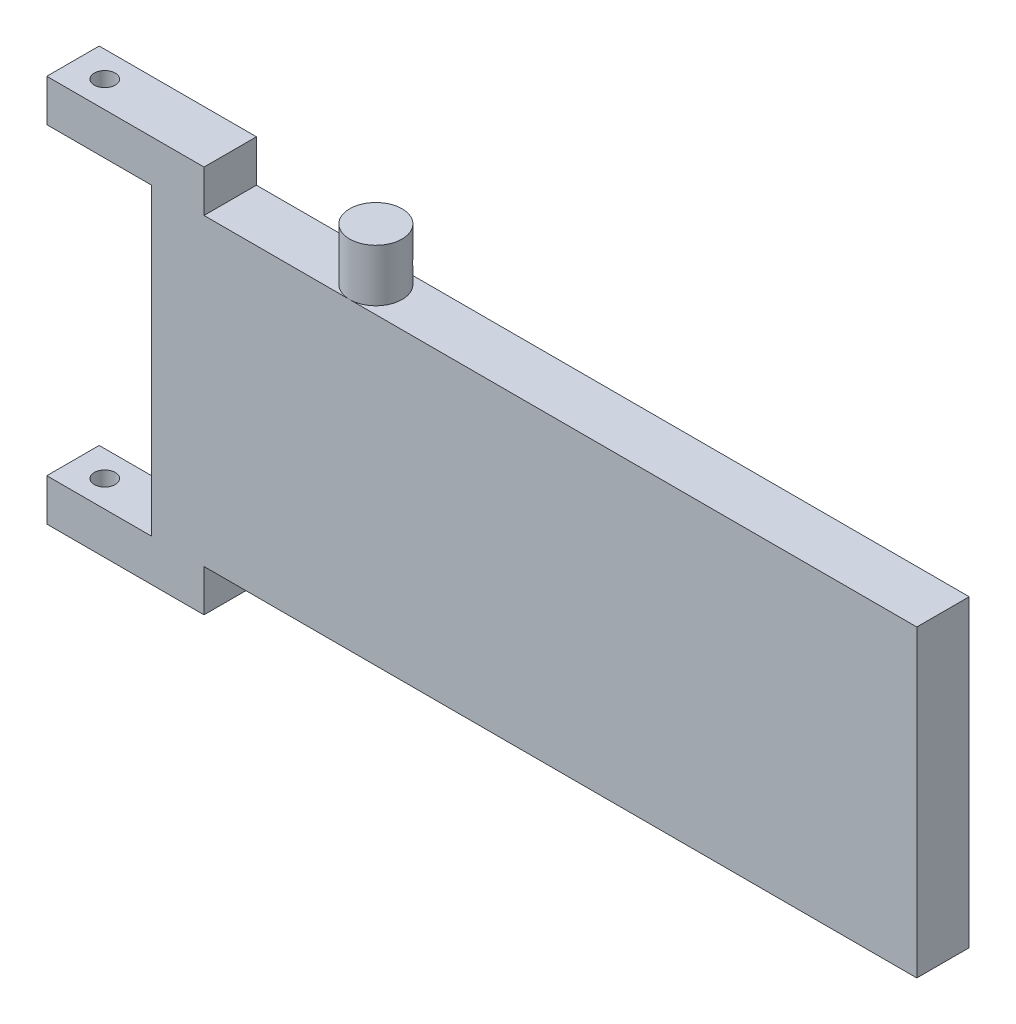
ISO-10303-21;
HEADER;
FILE_DESCRIPTION(('STEP AP214'),'2;1');
FILE_NAME('part.step','',(''),(''),'','','');
FILE_SCHEMA(('AUTOMOTIVE_DESIGN { 1 0 10303 214 1 1 1 1 }'));
ENDSEC;
DATA;
#1=APPLICATION_CONTEXT('core data for automotive mechanical design processes');
#2=APPLICATION_PROTOCOL_DEFINITION('international standard','automotive_design',2000,#1);
#3=PRODUCT_CONTEXT('',#1,'mechanical');
#4=PRODUCT('Part','Part','',(#3));
#5=PRODUCT_RELATED_PRODUCT_CATEGORY('part','',(#4));
#6=PRODUCT_DEFINITION_FORMATION('','',#4);
#7=PRODUCT_DEFINITION_CONTEXT('part definition',#1,'design');
#8=PRODUCT_DEFINITION('design','',#6,#7);
#9=PRODUCT_DEFINITION_SHAPE('','',#8);
#10=(LENGTH_UNIT() NAMED_UNIT(*) SI_UNIT(.MILLI.,.METRE.));
#11=(NAMED_UNIT(*) PLANE_ANGLE_UNIT() SI_UNIT($,.RADIAN.));
#12=(NAMED_UNIT(*) SI_UNIT($,.STERADIAN.) SOLID_ANGLE_UNIT());
#13=UNCERTAINTY_MEASURE_WITH_UNIT(LENGTH_MEASURE(1.E-05),#10,'distance_accuracy_value','');
#14=(GEOMETRIC_REPRESENTATION_CONTEXT(3) GLOBAL_UNCERTAINTY_ASSIGNED_CONTEXT((#13)) GLOBAL_UNIT_ASSIGNED_CONTEXT((#10,
#11,#12)) REPRESENTATION_CONTEXT('',''));
#15=CARTESIAN_POINT('',(0.,0.,0.));
#16=DIRECTION('',(0.,0.,1.));
#17=DIRECTION('',(1.,0.,0.));
#18=AXIS2_PLACEMENT_3D('',#15,#16,#17);
#19=CARTESIAN_POINT('',(18.8949988975342,34.,2.5));
#20=DIRECTION('',(0.,-1.,0.));
#21=DIRECTION('',(0.,0.,-1.));
#22=AXIS2_PLACEMENT_3D('',#19,#20,#21);
#23=CYLINDRICAL_SURFACE('',#22,2.5);
#24=CARTESIAN_POINT('',(18.8949988975342,34.,2.5));
#25=DIRECTION('',(0.,1.,0.));
#26=DIRECTION('',(0.,0.,1.));
#27=AXIS2_PLACEMENT_3D('',#24,#25,#26);
#28=CIRCLE('',#27,2.5);
#29=CARTESIAN_POINT('',(18.8949988975342,34.,5.));
#30=VERTEX_POINT('',#29);
#31=EDGE_CURVE('E223',#30,#30,#28,.T.);
#32=ORIENTED_EDGE('',*,*,#31,.F.);
#33=EDGE_LOOP('',(#32));
#34=FACE_BOUND('',#33,.T.);
#35=CARTESIAN_POINT('',(18.8949988975342,28.,2.5));
#36=DIRECTION('',(0.,-0.447213595499958,-0.894427190999916));
#37=DIRECTION('',(0.,-0.894427190999916,0.447213595499958));
#38=AXIS2_PLACEMENT_3D('',#35,#36,#37);
#39=ELLIPSE('',#38,5.59016994374948,2.5);
#40=CARTESIAN_POINT('',(16.8949988975342,31.,1.));
#41=VERTEX_POINT('',#40);
#42=CARTESIAN_POINT('',(20.8949988975342,31.,1.));
#43=VERTEX_POINT('',#42);
#44=EDGE_CURVE('E216',#41,#43,#39,.T.);
#45=ORIENTED_EDGE('',*,*,#44,.F.);
#46=CARTESIAN_POINT('',(18.8949988975342,34.,2.5));
#47=DIRECTION('',(0.,0.447213595499958,-0.894427190999916));
#48=DIRECTION('',(0.,-0.894427190999916,-0.447213595499958));
#49=AXIS2_PLACEMENT_3D('',#46,#47,#48);
#50=ELLIPSE('',#49,5.59016994374947,2.5);
#51=CARTESIAN_POINT('',(18.8949988975342,29.,0.));
#52=VERTEX_POINT('',#51);
#53=EDGE_CURVE('E204',#52,#41,#50,.T.);
#54=ORIENTED_EDGE('',*,*,#53,.F.);
#55=CARTESIAN_POINT('',(18.8949988975342,29.,2.5));
#56=DIRECTION('',(0.,1.,0.));
#57=DIRECTION('',(0.,0.,1.));
#58=AXIS2_PLACEMENT_3D('',#55,#56,#57);
#59=CIRCLE('',#58,2.5);
#60=CARTESIAN_POINT('',(18.8949988975342,29.,5.));
#61=VERTEX_POINT('',#60);
#62=EDGE_CURVE('E214',#52,#61,#59,.T.);
#63=ORIENTED_EDGE('',*,*,#62,.T.);
#64=EDGE_CURVE('E218',#61,#52,#59,.T.);
#65=ORIENTED_EDGE('',*,*,#64,.T.);
#66=EDGE_CURVE('E201',#43,#52,#50,.T.);
#67=ORIENTED_EDGE('',*,*,#66,.F.);
#68=EDGE_LOOP('',(#45,#54,#63,#65,#67));
#69=FACE_BOUND('',#68,.T.);
#70=ADVANCED_FACE('F39',(#34,#69),#23,.T.);
#71=CARTESIAN_POINT('',(0.,29.,5.));
#72=DIRECTION('',(0.,1.,0.));
#73=DIRECTION('',(0.,0.,1.));
#74=AXIS2_PLACEMENT_3D('',#71,#72,#73);
#75=PLANE('',#74);
#76=DIRECTION('',(1.,0.,0.));
#77=VECTOR('',#76,1.);
#78=CARTESIAN_POINT('',(0.,29.,5.));
#79=LINE('',#78,#77);
#80=CARTESIAN_POINT('',(5.,29.,5.));
#81=VERTEX_POINT('',#80);
#82=EDGE_CURVE('E232',#81,#61,#79,.T.);
#83=ORIENTED_EDGE('',*,*,#82,.T.);
#84=ORIENTED_EDGE('',*,*,#62,.F.);
#85=DIRECTION('',(1.,0.,0.));
#86=VECTOR('',#85,1.);
#87=CARTESIAN_POINT('',(0.,29.,0.));
#88=LINE('',#87,#86);
#89=CARTESIAN_POINT('',(5.,29.,0.));
#90=VERTEX_POINT('',#89);
#91=EDGE_CURVE('E230',#90,#52,#88,.T.);
#92=ORIENTED_EDGE('',*,*,#91,.F.);
#93=DIRECTION('',(0.,0.,-1.));
#94=VECTOR('',#93,1.);
#95=CARTESIAN_POINT('',(5.,29.,5.));
#96=LINE('',#95,#94);
#97=EDGE_CURVE('E317',#81,#90,#96,.T.);
#98=ORIENTED_EDGE('',*,*,#97,.F.);
#99=EDGE_LOOP('',(#83,#84,#92,#98));
#100=FACE_BOUND('',#99,.T.);
#101=ADVANCED_FACE('F228',(#100),#75,.T.);
#102=CARTESIAN_POINT('',(0.,0.,0.));
#103=DIRECTION('',(0.,0.,1.));
#104=DIRECTION('',(1.,0.,0.));
#105=AXIS2_PLACEMENT_3D('',#102,#103,#104);
#106=PLANE('',#105);
#107=DIRECTION('',(1.,0.,0.));
#108=VECTOR('',#107,1.);
#109=CARTESIAN_POINT('',(28.,19.,0.));
#110=LINE('',#109,#108);
#111=CARTESIAN_POINT('',(34.,19.,0.));
#112=VERTEX_POINT('',#111);
#113=CARTESIAN_POINT('',(38.,19.,0.));
#114=VERTEX_POINT('',#113);
#115=EDGE_CURVE('E380',#112,#114,#110,.T.);
#116=ORIENTED_EDGE('',*,*,#115,.F.);
#117=DIRECTION('',(0.,1.,0.));
#118=VECTOR('',#117,1.);
#119=CARTESIAN_POINT('',(34.,23.,0.));
#120=LINE('',#119,#118);
#121=CARTESIAN_POINT('',(34.,17.,0.));
#122=VERTEX_POINT('',#121);
#123=EDGE_CURVE('E399',#122,#112,#120,.T.);
#124=ORIENTED_EDGE('',*,*,#123,.F.);
#125=DIRECTION('',(-1.,0.,0.));
#126=VECTOR('',#125,1.);
#127=CARTESIAN_POINT('',(38.,17.,0.));
#128=LINE('',#127,#126);
#129=CARTESIAN_POINT('',(38.,17.,0.));
#130=VERTEX_POINT('',#129);
#131=EDGE_CURVE('E383',#130,#122,#128,.T.);
#132=ORIENTED_EDGE('',*,*,#131,.F.);
#133=DIRECTION('',(0.,-1.,0.));
#134=VECTOR('',#133,1.);
#135=CARTESIAN_POINT('',(38.,23.,0.));
#136=LINE('',#135,#134);
#137=EDGE_CURVE('E373',#114,#130,#136,.T.);
#138=ORIENTED_EDGE('',*,*,#137,.F.);
#139=EDGE_LOOP('',(#116,#124,#132,#138));
#140=FACE_BOUND('',#139,.T.);
#141=CARTESIAN_POINT('',(34.,21.,0.));
#142=VERTEX_POINT('',#141);
#143=CARTESIAN_POINT('',(34.,23.,0.));
#144=VERTEX_POINT('',#143);
#145=EDGE_CURVE('E398',#142,#144,#120,.T.);
#146=ORIENTED_EDGE('',*,*,#145,.F.);
#147=DIRECTION('',(1.,0.,0.));
#148=VECTOR('',#147,1.);
#149=CARTESIAN_POINT('',(28.,21.,0.));
#150=LINE('',#149,#148);
#151=CARTESIAN_POINT('',(38.,21.,0.));
#152=VERTEX_POINT('',#151);
#153=EDGE_CURVE('E387',#142,#152,#150,.T.);
#154=ORIENTED_EDGE('',*,*,#153,.T.);
#155=CARTESIAN_POINT('',(38.,23.,0.));
#156=VERTEX_POINT('',#155);
#157=EDGE_CURVE('E386',#156,#152,#136,.T.);
#158=ORIENTED_EDGE('',*,*,#157,.F.);
#159=DIRECTION('',(1.,0.,0.));
#160=VECTOR('',#159,1.);
#161=CARTESIAN_POINT('',(38.,23.,0.));
#162=LINE('',#161,#160);
#163=EDGE_CURVE('E402',#144,#156,#162,.T.);
#164=ORIENTED_EDGE('',*,*,#163,.F.);
#165=EDGE_LOOP('',(#146,#154,#158,#164));
#166=FACE_BOUND('',#165,.T.);
#167=DIRECTION('',(1.,0.,0.));
#168=VECTOR('',#167,1.);
#169=CARTESIAN_POINT('',(0.,0.,0.));
#170=LINE('',#169,#168);
#171=CARTESIAN_POINT('',(5.,0.,0.));
#172=VERTEX_POINT('',#171);
#173=CARTESIAN_POINT('',(73.,0.,0.));
#174=VERTEX_POINT('',#173);
#175=EDGE_CURVE('E432',#172,#174,#170,.T.);
#176=ORIENTED_EDGE('',*,*,#175,.F.);
#177=DIRECTION('',(0.,-1.,0.));
#178=VECTOR('',#177,1.);
#179=CARTESIAN_POINT('',(5.,0.,0.));
#180=LINE('',#179,#178);
#181=CARTESIAN_POINT('',(5.,-4.,0.));
#182=VERTEX_POINT('',#181);
#183=EDGE_CURVE('E282',#172,#182,#180,.T.);
#184=ORIENTED_EDGE('',*,*,#183,.T.);
#185=DIRECTION('',(-1.,0.,0.));
#186=VECTOR('',#185,1.);
#187=CARTESIAN_POINT('',(0.,-4.,0.));
#188=LINE('',#187,#186);
#189=CARTESIAN_POINT('',(-10.,-4.,0.));
#190=VERTEX_POINT('',#189);
#191=EDGE_CURVE('E278',#182,#190,#188,.T.);
#192=ORIENTED_EDGE('',*,*,#191,.T.);
#193=DIRECTION('',(0.,-1.,0.));
#194=VECTOR('',#193,1.);
#195=CARTESIAN_POINT('',(-10.,0.,0.));
#196=LINE('',#195,#194);
#197=CARTESIAN_POINT('',(-10.,0.,0.));
#198=VERTEX_POINT('',#197);
#199=EDGE_CURVE('E274',#198,#190,#196,.T.);
#200=ORIENTED_EDGE('',*,*,#199,.F.);
#201=DIRECTION('',(-1.,0.,0.));
#202=VECTOR('',#201,1.);
#203=CARTESIAN_POINT('',(0.,0.,0.));
#204=LINE('',#203,#202);
#205=CARTESIAN_POINT('',(0.,0.,0.));
#206=VERTEX_POINT('',#205);
#207=EDGE_CURVE('E271',#206,#198,#204,.T.);
#208=ORIENTED_EDGE('',*,*,#207,.F.);
#209=DIRECTION('',(0.,1.,0.));
#210=VECTOR('',#209,1.);
#211=CARTESIAN_POINT('',(0.,0.,0.));
#212=LINE('',#211,#210);
#213=CARTESIAN_POINT('',(0.,29.,0.));
#214=VERTEX_POINT('',#213);
#215=EDGE_CURVE('E267',#206,#214,#212,.T.);
#216=ORIENTED_EDGE('',*,*,#215,.T.);
#217=DIRECTION('',(-1.,0.,0.));
#218=VECTOR('',#217,1.);
#219=CARTESIAN_POINT('',(0.,29.,0.));
#220=LINE('',#219,#218);
#221=CARTESIAN_POINT('',(-10.,29.,0.));
#222=VERTEX_POINT('',#221);
#223=EDGE_CURVE('E263',#214,#222,#220,.T.);
#224=ORIENTED_EDGE('',*,*,#223,.T.);
#225=DIRECTION('',(0.,1.,0.));
#226=VECTOR('',#225,1.);
#227=CARTESIAN_POINT('',(-10.,0.,0.));
#228=LINE('',#227,#226);
#229=CARTESIAN_POINT('',(-10.,33.,0.));
#230=VERTEX_POINT('',#229);
#231=EDGE_CURVE('E259',#222,#230,#228,.T.);
#232=ORIENTED_EDGE('',*,*,#231,.T.);
#233=DIRECTION('',(-1.,0.,0.));
#234=VECTOR('',#233,1.);
#235=CARTESIAN_POINT('',(0.,33.,0.));
#236=LINE('',#235,#234);
#237=CARTESIAN_POINT('',(5.,33.,0.));
#238=VERTEX_POINT('',#237);
#239=EDGE_CURVE('E251',#238,#230,#236,.T.);
#240=ORIENTED_EDGE('',*,*,#239,.F.);
#241=DIRECTION('',(0.,1.,0.));
#242=VECTOR('',#241,1.);
#243=CARTESIAN_POINT('',(5.,0.,0.));
#244=LINE('',#243,#242);
#245=EDGE_CURVE('E248',#90,#238,#244,.T.);
#246=ORIENTED_EDGE('',*,*,#245,.F.);
#247=ORIENTED_EDGE('',*,*,#91,.T.);
#248=CARTESIAN_POINT('',(73.,29.,0.));
#249=VERTEX_POINT('',#248);
#250=EDGE_CURVE('E235',#52,#249,#88,.T.);
#251=ORIENTED_EDGE('',*,*,#250,.T.);
#252=DIRECTION('',(0.,1.,0.));
#253=VECTOR('',#252,1.);
#254=CARTESIAN_POINT('',(73.,0.,0.));
#255=LINE('',#254,#253);
#256=EDGE_CURVE('E242',#174,#249,#255,.T.);
#257=ORIENTED_EDGE('',*,*,#256,.F.);
#258=EDGE_LOOP('',(#176,#184,#192,#200,#208,#216,#224,#232,#240,#246,#247,#251,#257));
#259=FACE_BOUND('',#258,.T.);
#260=ADVANCED_FACE('F246',(#140,#166,#259),#106,.F.);
#261=CARTESIAN_POINT('',(0.,0.,5.));
#262=DIRECTION('',(0.,1.,0.));
#263=DIRECTION('',(0.,0.,1.));
#264=AXIS2_PLACEMENT_3D('',#261,#262,#263);
#265=PLANE('',#264);
#266=ORIENTED_EDGE('',*,*,#175,.T.);
#267=DIRECTION('',(0.,0.,-1.));
#268=VECTOR('',#267,1.);
#269=CARTESIAN_POINT('',(73.,0.,5.));
#270=LINE('',#269,#268);
#271=CARTESIAN_POINT('',(73.,0.,5.));
#272=VERTEX_POINT('',#271);
#273=EDGE_CURVE('E322',#272,#174,#270,.T.);
#274=ORIENTED_EDGE('',*,*,#273,.F.);
#275=DIRECTION('',(1.,0.,0.));
#276=VECTOR('',#275,1.);
#277=CARTESIAN_POINT('',(0.,0.,5.));
#278=LINE('',#277,#276);
#279=CARTESIAN_POINT('',(5.,0.,5.));
#280=VERTEX_POINT('',#279);
#281=EDGE_CURVE('E286',#280,#272,#278,.T.);
#282=ORIENTED_EDGE('',*,*,#281,.F.);
#283=DIRECTION('',(0.,0.,-1.));
#284=VECTOR('',#283,1.);
#285=CARTESIAN_POINT('',(5.,0.,5.));
#286=LINE('',#285,#284);
#287=EDGE_CURVE('E287',#280,#172,#286,.T.);
#288=ORIENTED_EDGE('',*,*,#287,.T.);
#289=EDGE_LOOP('',(#266,#274,#282,#288));
#290=FACE_BOUND('',#289,.T.);
#291=ADVANCED_FACE('F522',(#290),#265,.F.);
#292=CARTESIAN_POINT('',(73.,0.,5.));
#293=DIRECTION('',(-1.,0.,0.));
#294=DIRECTION('',(0.,0.,1.));
#295=AXIS2_PLACEMENT_3D('',#292,#293,#294);
#296=PLANE('',#295);
#297=ORIENTED_EDGE('',*,*,#256,.T.);
#298=DIRECTION('',(0.,0.,-1.));
#299=VECTOR('',#298,1.);
#300=CARTESIAN_POINT('',(73.,29.,5.));
#301=LINE('',#300,#299);
#302=CARTESIAN_POINT('',(73.,29.,5.));
#303=VERTEX_POINT('',#302);
#304=EDGE_CURVE('E238',#303,#249,#301,.T.);
#305=ORIENTED_EDGE('',*,*,#304,.F.);
#306=DIRECTION('',(0.,1.,0.));
#307=VECTOR('',#306,1.);
#308=CARTESIAN_POINT('',(73.,0.,5.));
#309=LINE('',#308,#307);
#310=EDGE_CURVE('E436',#272,#303,#309,.T.);
#311=ORIENTED_EDGE('',*,*,#310,.F.);
#312=ORIENTED_EDGE('',*,*,#273,.T.);
#313=EDGE_LOOP('',(#297,#305,#311,#312));
#314=FACE_BOUND('',#313,.T.);
#315=ADVANCED_FACE('F479',(#314),#296,.F.);
#316=ORIENTED_EDGE('',*,*,#250,.F.);
#317=ORIENTED_EDGE('',*,*,#64,.F.);
#318=EDGE_CURVE('E440',#61,#303,#79,.T.);
#319=ORIENTED_EDGE('',*,*,#318,.T.);
#320=ORIENTED_EDGE('',*,*,#304,.T.);
#321=EDGE_LOOP('',(#316,#317,#319,#320));
#322=FACE_BOUND('',#321,.T.);
#323=ADVANCED_FACE('F236',(#322),#75,.T.);
#324=CARTESIAN_POINT('',(5.,0.,5.));
#325=DIRECTION('',(-1.,0.,0.));
#326=DIRECTION('',(0.,0.,1.));
#327=AXIS2_PLACEMENT_3D('',#324,#325,#326);
#328=PLANE('',#327);
#329=ORIENTED_EDGE('',*,*,#245,.T.);
#330=DIRECTION('',(0.,0.,-1.));
#331=VECTOR('',#330,1.);
#332=CARTESIAN_POINT('',(5.,33.,5.));
#333=LINE('',#332,#331);
#334=CARTESIAN_POINT('',(5.,33.,5.));
#335=VERTEX_POINT('',#334);
#336=EDGE_CURVE('E313',#335,#238,#333,.T.);
#337=ORIENTED_EDGE('',*,*,#336,.F.);
#338=DIRECTION('',(0.,1.,0.));
#339=VECTOR('',#338,1.);
#340=CARTESIAN_POINT('',(5.,0.,5.));
#341=LINE('',#340,#339);
#342=EDGE_CURVE('E443',#81,#335,#341,.T.);
#343=ORIENTED_EDGE('',*,*,#342,.F.);
#344=ORIENTED_EDGE('',*,*,#97,.T.);
#345=EDGE_LOOP('',(#329,#337,#343,#344));
#346=FACE_BOUND('',#345,.T.);
#347=ADVANCED_FACE('F518',(#346),#328,.F.);
#348=CARTESIAN_POINT('',(0.,33.,5.));
#349=DIRECTION('',(0.,-1.,0.));
#350=DIRECTION('',(0.,0.,-1.));
#351=AXIS2_PLACEMENT_3D('',#348,#349,#350);
#352=PLANE('',#351);
#353=CARTESIAN_POINT('',(-7.,33.,2.46940407953389));
#354=DIRECTION('',(0.,1.,0.));
#355=DIRECTION('',(0.,0.,1.));
#356=AXIS2_PLACEMENT_3D('',#353,#354,#355);
#357=CIRCLE('',#356,1.);
#358=CARTESIAN_POINT('',(-7.,33.,3.46940407953389));
#359=VERTEX_POINT('',#358);
#360=EDGE_CURVE('E422',#359,#359,#357,.T.);
#361=ORIENTED_EDGE('',*,*,#360,.F.);
#362=EDGE_LOOP('',(#361));
#363=FACE_BOUND('',#362,.T.);
#364=ORIENTED_EDGE('',*,*,#239,.T.);
#365=DIRECTION('',(0.,0.,-1.));
#366=VECTOR('',#365,1.);
#367=CARTESIAN_POINT('',(-10.,33.,5.));
#368=LINE('',#367,#366);
#369=CARTESIAN_POINT('',(-10.,33.,5.));
#370=VERTEX_POINT('',#369);
#371=EDGE_CURVE('E310',#370,#230,#368,.T.);
#372=ORIENTED_EDGE('',*,*,#371,.F.);
#373=DIRECTION('',(-1.,0.,0.));
#374=VECTOR('',#373,1.);
#375=CARTESIAN_POINT('',(0.,33.,5.));
#376=LINE('',#375,#374);
#377=EDGE_CURVE('E446',#335,#370,#376,.T.);
#378=ORIENTED_EDGE('',*,*,#377,.F.);
#379=ORIENTED_EDGE('',*,*,#336,.T.);
#380=EDGE_LOOP('',(#364,#372,#378,#379));
#381=FACE_BOUND('',#380,.T.);
#382=ADVANCED_FACE('F514',(#363,#381),#352,.F.);
#383=CARTESIAN_POINT('',(-10.,0.,5.));
#384=DIRECTION('',(-1.,0.,0.));
#385=DIRECTION('',(0.,0.,1.));
#386=AXIS2_PLACEMENT_3D('',#383,#384,#385);
#387=PLANE('',#386);
#388=ORIENTED_EDGE('',*,*,#231,.F.);
#389=DIRECTION('',(0.,0.,-1.));
#390=VECTOR('',#389,1.);
#391=CARTESIAN_POINT('',(-10.,29.,5.));
#392=LINE('',#391,#390);
#393=CARTESIAN_POINT('',(-10.,29.,5.));
#394=VERTEX_POINT('',#393);
#395=EDGE_CURVE('E307',#394,#222,#392,.T.);
#396=ORIENTED_EDGE('',*,*,#395,.F.);
#397=DIRECTION('',(0.,1.,0.));
#398=VECTOR('',#397,1.);
#399=CARTESIAN_POINT('',(-10.,0.,5.));
#400=LINE('',#399,#398);
#401=EDGE_CURVE('E449',#394,#370,#400,.T.);
#402=ORIENTED_EDGE('',*,*,#401,.T.);
#403=ORIENTED_EDGE('',*,*,#371,.T.);
#404=EDGE_LOOP('',(#388,#396,#402,#403));
#405=FACE_BOUND('',#404,.T.);
#406=ADVANCED_FACE('F510',(#405),#387,.T.);
#407=CARTESIAN_POINT('',(0.,29.,5.));
#408=DIRECTION('',(0.,-1.,0.));
#409=DIRECTION('',(1.,0.,0.));
#410=AXIS2_PLACEMENT_3D('',#407,#408,#409);
#411=PLANE('',#410);
#412=CARTESIAN_POINT('',(-7.,29.,2.46940407953389));
#413=DIRECTION('',(0.,-1.,0.));
#414=DIRECTION('',(1.,0.,0.));
#415=AXIS2_PLACEMENT_3D('',#412,#413,#414);
#416=CIRCLE('',#415,1.);
#417=CARTESIAN_POINT('',(-6.,29.,2.46940407953389));
#418=VERTEX_POINT('',#417);
#419=EDGE_CURVE('E331',#418,#418,#416,.T.);
#420=ORIENTED_EDGE('',*,*,#419,.F.);
#421=EDGE_LOOP('',(#420));
#422=FACE_BOUND('',#421,.T.);
#423=ORIENTED_EDGE('',*,*,#223,.F.);
#424=DIRECTION('',(0.,0.,-1.));
#425=VECTOR('',#424,1.);
#426=CARTESIAN_POINT('',(0.,29.,5.));
#427=LINE('',#426,#425);
#428=CARTESIAN_POINT('',(0.,29.,5.));
#429=VERTEX_POINT('',#428);
#430=EDGE_CURVE('E304',#429,#214,#427,.T.);
#431=ORIENTED_EDGE('',*,*,#430,.F.);
#432=DIRECTION('',(-1.,0.,0.));
#433=VECTOR('',#432,1.);
#434=CARTESIAN_POINT('',(0.,29.,5.));
#435=LINE('',#434,#433);
#436=EDGE_CURVE('E453',#429,#394,#435,.T.);
#437=ORIENTED_EDGE('',*,*,#436,.T.);
#438=ORIENTED_EDGE('',*,*,#395,.T.);
#439=EDGE_LOOP('',(#423,#431,#437,#438));
#440=FACE_BOUND('',#439,.T.);
#441=ADVANCED_FACE('F506',(#422,#440),#411,.T.);
#442=CARTESIAN_POINT('',(0.,0.,5.));
#443=DIRECTION('',(-1.,0.,0.));
#444=DIRECTION('',(0.,0.,1.));
#445=AXIS2_PLACEMENT_3D('',#442,#443,#444);
#446=PLANE('',#445);
#447=ORIENTED_EDGE('',*,*,#215,.F.);
#448=DIRECTION('',(0.,0.,-1.));
#449=VECTOR('',#448,1.);
#450=CARTESIAN_POINT('',(0.,0.,5.));
#451=LINE('',#450,#449);
#452=CARTESIAN_POINT('',(0.,0.,5.));
#453=VERTEX_POINT('',#452);
#454=EDGE_CURVE('E301',#453,#206,#451,.T.);
#455=ORIENTED_EDGE('',*,*,#454,.F.);
#456=DIRECTION('',(0.,1.,0.));
#457=VECTOR('',#456,1.);
#458=CARTESIAN_POINT('',(0.,0.,5.));
#459=LINE('',#458,#457);
#460=EDGE_CURVE('E457',#453,#429,#459,.T.);
#461=ORIENTED_EDGE('',*,*,#460,.T.);
#462=ORIENTED_EDGE('',*,*,#430,.T.);
#463=EDGE_LOOP('',(#447,#455,#461,#462));
#464=FACE_BOUND('',#463,.T.);
#465=ADVANCED_FACE('F502',(#464),#446,.T.);
#466=CARTESIAN_POINT('',(0.,0.,5.));
#467=DIRECTION('',(0.,-1.,0.));
#468=DIRECTION('',(1.,0.,0.));
#469=AXIS2_PLACEMENT_3D('',#466,#467,#468);
#470=PLANE('',#469);
#471=CARTESIAN_POINT('',(-7.,0.,2.46940407953389));
#472=DIRECTION('',(0.,-1.,0.));
#473=DIRECTION('',(1.,0.,0.));
#474=AXIS2_PLACEMENT_3D('',#471,#472,#473);
#475=CIRCLE('',#474,1.);
#476=CARTESIAN_POINT('',(-6.,0.,2.46940407953389));
#477=VERTEX_POINT('',#476);
#478=EDGE_CURVE('E327',#477,#477,#475,.T.);
#479=ORIENTED_EDGE('',*,*,#478,.T.);
#480=EDGE_LOOP('',(#479));
#481=FACE_BOUND('',#480,.T.);
#482=ORIENTED_EDGE('',*,*,#207,.T.);
#483=DIRECTION('',(0.,0.,-1.));
#484=VECTOR('',#483,1.);
#485=CARTESIAN_POINT('',(-10.,0.,5.));
#486=LINE('',#485,#484);
#487=CARTESIAN_POINT('',(-10.,0.,5.));
#488=VERTEX_POINT('',#487);
#489=EDGE_CURVE('E297',#488,#198,#486,.T.);
#490=ORIENTED_EDGE('',*,*,#489,.F.);
#491=DIRECTION('',(-1.,0.,0.));
#492=VECTOR('',#491,1.);
#493=CARTESIAN_POINT('',(0.,0.,5.));
#494=LINE('',#493,#492);
#495=EDGE_CURVE('E461',#453,#488,#494,.T.);
#496=ORIENTED_EDGE('',*,*,#495,.F.);
#497=ORIENTED_EDGE('',*,*,#454,.T.);
#498=EDGE_LOOP('',(#482,#490,#496,#497));
#499=FACE_BOUND('',#498,.T.);
#500=ADVANCED_FACE('F499',(#481,#499),#470,.F.);
#501=CARTESIAN_POINT('',(-10.,0.,5.));
#502=DIRECTION('',(1.,0.,0.));
#503=DIRECTION('',(0.,0.,-1.));
#504=AXIS2_PLACEMENT_3D('',#501,#502,#503);
#505=PLANE('',#504);
#506=ORIENTED_EDGE('',*,*,#199,.T.);
#507=DIRECTION('',(0.,0.,-1.));
#508=VECTOR('',#507,1.);
#509=CARTESIAN_POINT('',(-10.,-4.,5.));
#510=LINE('',#509,#508);
#511=CARTESIAN_POINT('',(-10.,-4.,5.));
#512=VERTEX_POINT('',#511);
#513=EDGE_CURVE('E294',#512,#190,#510,.T.);
#514=ORIENTED_EDGE('',*,*,#513,.F.);
#515=DIRECTION('',(0.,-1.,0.));
#516=VECTOR('',#515,1.);
#517=CARTESIAN_POINT('',(-10.,0.,5.));
#518=LINE('',#517,#516);
#519=EDGE_CURVE('E464',#488,#512,#518,.T.);
#520=ORIENTED_EDGE('',*,*,#519,.F.);
#521=ORIENTED_EDGE('',*,*,#489,.T.);
#522=EDGE_LOOP('',(#506,#514,#520,#521));
#523=FACE_BOUND('',#522,.T.);
#524=ADVANCED_FACE('F494',(#523),#505,.F.);
#525=CARTESIAN_POINT('',(0.,-4.,5.));
#526=DIRECTION('',(0.,-1.,0.));
#527=DIRECTION('',(1.,0.,0.));
#528=AXIS2_PLACEMENT_3D('',#525,#526,#527);
#529=PLANE('',#528);
#530=ORIENTED_EDGE('',*,*,#191,.F.);
#531=DIRECTION('',(0.,0.,-1.));
#532=VECTOR('',#531,1.);
#533=CARTESIAN_POINT('',(5.,-4.,5.));
#534=LINE('',#533,#532);
#535=CARTESIAN_POINT('',(5.,-4.,5.));
#536=VERTEX_POINT('',#535);
#537=EDGE_CURVE('E290',#536,#182,#534,.T.);
#538=ORIENTED_EDGE('',*,*,#537,.F.);
#539=DIRECTION('',(-1.,0.,0.));
#540=VECTOR('',#539,1.);
#541=CARTESIAN_POINT('',(0.,-4.,5.));
#542=LINE('',#541,#540);
#543=EDGE_CURVE('E467',#536,#512,#542,.T.);
#544=ORIENTED_EDGE('',*,*,#543,.T.);
#545=ORIENTED_EDGE('',*,*,#513,.T.);
#546=EDGE_LOOP('',(#530,#538,#544,#545));
#547=FACE_BOUND('',#546,.T.);
#548=ADVANCED_FACE('F488',(#547),#529,.T.);
#549=CARTESIAN_POINT('',(5.,0.,5.));
#550=DIRECTION('',(1.,0.,0.));
#551=DIRECTION('',(0.,1.,0.));
#552=AXIS2_PLACEMENT_3D('',#549,#550,#551);
#553=PLANE('',#552);
#554=ORIENTED_EDGE('',*,*,#183,.F.);
#555=ORIENTED_EDGE('',*,*,#287,.F.);
#556=DIRECTION('',(0.,-1.,0.));
#557=VECTOR('',#556,1.);
#558=CARTESIAN_POINT('',(5.,0.,5.));
#559=LINE('',#558,#557);
#560=EDGE_CURVE('E291',#280,#536,#559,.T.);
#561=ORIENTED_EDGE('',*,*,#560,.T.);
#562=ORIENTED_EDGE('',*,*,#537,.T.);
#563=EDGE_LOOP('',(#554,#555,#561,#562));
#564=FACE_BOUND('',#563,.T.);
#565=ADVANCED_FACE('F482',(#564),#553,.T.);
#566=CARTESIAN_POINT('',(0.,0.,5.));
#567=DIRECTION('',(0.,0.,1.));
#568=DIRECTION('',(1.,0.,0.));
#569=AXIS2_PLACEMENT_3D('',#566,#567,#568);
#570=PLANE('',#569);
#571=ORIENTED_EDGE('',*,*,#281,.T.);
#572=ORIENTED_EDGE('',*,*,#310,.T.);
#573=ORIENTED_EDGE('',*,*,#318,.F.);
#574=ORIENTED_EDGE('',*,*,#82,.F.);
#575=ORIENTED_EDGE('',*,*,#342,.T.);
#576=ORIENTED_EDGE('',*,*,#377,.T.);
#577=ORIENTED_EDGE('',*,*,#401,.F.);
#578=ORIENTED_EDGE('',*,*,#436,.F.);
#579=ORIENTED_EDGE('',*,*,#460,.F.);
#580=ORIENTED_EDGE('',*,*,#495,.T.);
#581=ORIENTED_EDGE('',*,*,#519,.T.);
#582=ORIENTED_EDGE('',*,*,#543,.F.);
#583=ORIENTED_EDGE('',*,*,#560,.F.);
#584=EDGE_LOOP('',(#571,#572,#573,#574,#575,#576,#577,#578,#579,#580,#581,#582,#583));
#585=FACE_BOUND('',#584,.T.);
#586=ADVANCED_FACE('F520',(#585),#570,.T.);
#587=CARTESIAN_POINT('',(-7.,-2.,2.46940407953389));
#588=DIRECTION('',(0.,1.,0.));
#589=DIRECTION('',(0.,0.,1.));
#590=AXIS2_PLACEMENT_3D('',#587,#588,#589);
#591=PLANE('',#590);
#592=CARTESIAN_POINT('',(-7.,-2.,2.46940407953389));
#593=DIRECTION('',(0.,1.,0.));
#594=DIRECTION('',(0.,0.,1.));
#595=AXIS2_PLACEMENT_3D('',#592,#593,#594);
#596=CIRCLE('',#595,1.);
#597=CARTESIAN_POINT('',(-7.,-2.,3.46940407953389));
#598=VERTEX_POINT('',#597);
#599=EDGE_CURVE('E332',#598,#598,#596,.T.);
#600=ORIENTED_EDGE('',*,*,#599,.T.);
#601=EDGE_LOOP('',(#600));
#602=FACE_BOUND('',#601,.T.);
#603=ADVANCED_FACE('F571',(#602),#591,.T.);
#604=CARTESIAN_POINT('',(-7.,-2.,2.46940407953389));
#605=DIRECTION('',(0.,1.,0.));
#606=DIRECTION('',(0.,0.,1.));
#607=AXIS2_PLACEMENT_3D('',#604,#605,#606);
#608=CYLINDRICAL_SURFACE('',#607,1.);
#609=ORIENTED_EDGE('',*,*,#599,.F.);
#610=EDGE_LOOP('',(#609));
#611=FACE_BOUND('',#610,.T.);
#612=ORIENTED_EDGE('',*,*,#478,.F.);
#613=EDGE_LOOP('',(#612));
#614=FACE_BOUND('',#613,.T.);
#615=ADVANCED_FACE('F574',(#611,#614),#608,.F.);
#616=ORIENTED_EDGE('',*,*,#419,.T.);
#617=EDGE_LOOP('',(#616));
#618=FACE_BOUND('',#617,.T.);
#619=ORIENTED_EDGE('',*,*,#360,.T.);
#620=EDGE_LOOP('',(#619));
#621=FACE_BOUND('',#620,.T.);
#622=ADVANCED_FACE('F570',(#618,#621),#608,.F.);
#623=CARTESIAN_POINT('',(38.,23.,-5.));
#624=DIRECTION('',(-1.,0.,0.));
#625=DIRECTION('',(0.,0.,1.));
#626=AXIS2_PLACEMENT_3D('',#623,#624,#625);
#627=PLANE('',#626);
#628=DIRECTION('',(0.,0.,1.));
#629=VECTOR('',#628,1.);
#630=CARTESIAN_POINT('',(38.,21.,0.));
#631=LINE('',#630,#629);
#632=CARTESIAN_POINT('',(38.,21.,-4.));
#633=VERTEX_POINT('',#632);
#634=EDGE_CURVE('E55',#633,#152,#631,.T.);
#635=ORIENTED_EDGE('',*,*,#634,.F.);
#636=DIRECTION('',(0.,1.,0.));
#637=VECTOR('',#636,1.);
#638=CARTESIAN_POINT('',(38.,23.,-4.));
#639=LINE('',#638,#637);
#640=CARTESIAN_POINT('',(38.,19.,-4.));
#641=VERTEX_POINT('',#640);
#642=EDGE_CURVE('E351',#633,#641,#639,.F.);
#643=ORIENTED_EDGE('',*,*,#642,.T.);
#644=DIRECTION('',(0.,0.,-1.));
#645=VECTOR('',#644,1.);
#646=CARTESIAN_POINT('',(38.,19.,0.));
#647=LINE('',#646,#645);
#648=EDGE_CURVE('E62',#114,#641,#647,.T.);
#649=ORIENTED_EDGE('',*,*,#648,.F.);
#650=ORIENTED_EDGE('',*,*,#137,.T.);
#651=DIRECTION('',(0.,0.,1.));
#652=VECTOR('',#651,1.);
#653=CARTESIAN_POINT('',(38.,17.,-5.));
#654=LINE('',#653,#652);
#655=CARTESIAN_POINT('',(38.,17.,-5.));
#656=VERTEX_POINT('',#655);
#657=EDGE_CURVE('E419',#656,#130,#654,.T.);
#658=ORIENTED_EDGE('',*,*,#657,.F.);
#659=DIRECTION('',(0.,-1.,0.));
#660=VECTOR('',#659,1.);
#661=CARTESIAN_POINT('',(38.,23.,-5.));
#662=LINE('',#661,#660);
#663=CARTESIAN_POINT('',(38.,23.,-5.));
#664=VERTEX_POINT('',#663);
#665=EDGE_CURVE('E406',#664,#656,#662,.T.);
#666=ORIENTED_EDGE('',*,*,#665,.F.);
#667=DIRECTION('',(0.,0.,1.));
#668=VECTOR('',#667,1.);
#669=CARTESIAN_POINT('',(38.,23.,-5.));
#670=LINE('',#669,#668);
#671=EDGE_CURVE('E407',#664,#156,#670,.T.);
#672=ORIENTED_EDGE('',*,*,#671,.T.);
#673=ORIENTED_EDGE('',*,*,#157,.T.);
#674=EDGE_LOOP('',(#635,#643,#649,#650,#658,#666,#672,#673));
#675=FACE_BOUND('',#674,.T.);
#676=ADVANCED_FACE('F370',(#675),#627,.F.);
#677=CARTESIAN_POINT('',(38.,17.,-5.));
#678=DIRECTION('',(0.,1.,0.));
#679=DIRECTION('',(-1.,0.,0.));
#680=AXIS2_PLACEMENT_3D('',#677,#678,#679);
#681=PLANE('',#680);
#682=ORIENTED_EDGE('',*,*,#131,.T.);
#683=DIRECTION('',(0.,0.,1.));
#684=VECTOR('',#683,1.);
#685=CARTESIAN_POINT('',(34.,17.,-5.));
#686=LINE('',#685,#684);
#687=CARTESIAN_POINT('',(34.,17.,-5.));
#688=VERTEX_POINT('',#687);
#689=EDGE_CURVE('E415',#688,#122,#686,.T.);
#690=ORIENTED_EDGE('',*,*,#689,.F.);
#691=DIRECTION('',(-1.,0.,0.));
#692=VECTOR('',#691,1.);
#693=CARTESIAN_POINT('',(38.,17.,-5.));
#694=LINE('',#693,#692);
#695=EDGE_CURVE('E850',#656,#688,#694,.T.);
#696=ORIENTED_EDGE('',*,*,#695,.F.);
#697=ORIENTED_EDGE('',*,*,#657,.T.);
#698=EDGE_LOOP('',(#682,#690,#696,#697));
#699=FACE_BOUND('',#698,.T.);
#700=ADVANCED_FACE('F563',(#699),#681,.F.);
#701=CARTESIAN_POINT('',(34.,23.,-5.));
#702=DIRECTION('',(1.,0.,0.));
#703=DIRECTION('',(0.,0.,-1.));
#704=AXIS2_PLACEMENT_3D('',#701,#702,#703);
#705=PLANE('',#704);
#706=DIRECTION('',(0.,1.,0.));
#707=VECTOR('',#706,1.);
#708=CARTESIAN_POINT('',(34.,23.,-4.));
#709=LINE('',#708,#707);
#710=CARTESIAN_POINT('',(34.,19.,-4.));
#711=VERTEX_POINT('',#710);
#712=CARTESIAN_POINT('',(34.,21.,-4.));
#713=VERTEX_POINT('',#712);
#714=EDGE_CURVE('E340',#711,#713,#709,.T.);
#715=ORIENTED_EDGE('',*,*,#714,.T.);
#716=DIRECTION('',(0.,0.,1.));
#717=VECTOR('',#716,1.);
#718=CARTESIAN_POINT('',(34.,21.,-5.));
#719=LINE('',#718,#717);
#720=EDGE_CURVE('E211',#713,#142,#719,.T.);
#721=ORIENTED_EDGE('',*,*,#720,.T.);
#722=ORIENTED_EDGE('',*,*,#145,.T.);
#723=DIRECTION('',(0.,0.,1.));
#724=VECTOR('',#723,1.);
#725=CARTESIAN_POINT('',(34.,23.,-5.));
#726=LINE('',#725,#724);
#727=CARTESIAN_POINT('',(34.,23.,-5.));
#728=VERTEX_POINT('',#727);
#729=EDGE_CURVE('E411',#728,#144,#726,.T.);
#730=ORIENTED_EDGE('',*,*,#729,.F.);
#731=DIRECTION('',(0.,1.,0.));
#732=VECTOR('',#731,1.);
#733=CARTESIAN_POINT('',(34.,23.,-5.));
#734=LINE('',#733,#732);
#735=EDGE_CURVE('E852',#688,#728,#734,.T.);
#736=ORIENTED_EDGE('',*,*,#735,.F.);
#737=ORIENTED_EDGE('',*,*,#689,.T.);
#738=ORIENTED_EDGE('',*,*,#123,.T.);
#739=DIRECTION('',(0.,0.,-1.));
#740=VECTOR('',#739,1.);
#741=CARTESIAN_POINT('',(34.,19.,-5.));
#742=LINE('',#741,#740);
#743=EDGE_CURVE('E326',#112,#711,#742,.T.);
#744=ORIENTED_EDGE('',*,*,#743,.T.);
#745=EDGE_LOOP('',(#715,#721,#722,#730,#736,#737,#738,#744));
#746=FACE_BOUND('',#745,.T.);
#747=ADVANCED_FACE('F559',(#746),#705,.F.);
#748=CARTESIAN_POINT('',(38.,23.,-5.));
#749=DIRECTION('',(0.,-1.,0.));
#750=DIRECTION('',(0.,0.,-1.));
#751=AXIS2_PLACEMENT_3D('',#748,#749,#750);
#752=PLANE('',#751);
#753=ORIENTED_EDGE('',*,*,#163,.T.);
#754=ORIENTED_EDGE('',*,*,#671,.F.);
#755=DIRECTION('',(1.,0.,0.));
#756=VECTOR('',#755,1.);
#757=CARTESIAN_POINT('',(38.,23.,-5.));
#758=LINE('',#757,#756);
#759=EDGE_CURVE('E394',#728,#664,#758,.T.);
#760=ORIENTED_EDGE('',*,*,#759,.F.);
#761=ORIENTED_EDGE('',*,*,#729,.T.);
#762=EDGE_LOOP('',(#753,#754,#760,#761));
#763=FACE_BOUND('',#762,.T.);
#764=ADVANCED_FACE('F555',(#763),#752,.F.);
#765=CARTESIAN_POINT('',(0.,0.,-5.));
#766=DIRECTION('',(0.,0.,-1.));
#767=DIRECTION('',(-1.,0.,0.));
#768=AXIS2_PLACEMENT_3D('',#765,#766,#767);
#769=PLANE('',#768);
#770=ORIENTED_EDGE('',*,*,#665,.T.);
#771=ORIENTED_EDGE('',*,*,#695,.T.);
#772=ORIENTED_EDGE('',*,*,#735,.T.);
#773=ORIENTED_EDGE('',*,*,#759,.T.);
#774=EDGE_LOOP('',(#770,#771,#772,#773));
#775=FACE_BOUND('',#774,.T.);
#776=ADVANCED_FACE('F546',(#775),#769,.T.);
#777=CARTESIAN_POINT('',(28.,21.,0.));
#778=DIRECTION('',(0.,1.,0.));
#779=DIRECTION('',(0.,0.,1.));
#780=AXIS2_PLACEMENT_3D('',#777,#778,#779);
#781=PLANE('',#780);
#782=ORIENTED_EDGE('',*,*,#720,.F.);
#783=CARTESIAN_POINT('',(35.,21.,-4.));
#784=DIRECTION('',(0.,1.,0.));
#785=DIRECTION('',(0.,0.,1.));
#786=AXIS2_PLACEMENT_3D('',#783,#784,#785);
#787=CIRCLE('',#786,1.);
#788=CARTESIAN_POINT('',(35.,21.,-3.));
#789=VERTEX_POINT('',#788);
#790=EDGE_CURVE('E354',#713,#789,#787,.T.);
#791=ORIENTED_EDGE('',*,*,#790,.T.);
#792=DIRECTION('',(1.,0.,0.));
#793=VECTOR('',#792,1.);
#794=CARTESIAN_POINT('',(28.,21.,-3.));
#795=LINE('',#794,#793);
#796=CARTESIAN_POINT('',(37.,21.,-3.));
#797=VERTEX_POINT('',#796);
#798=EDGE_CURVE('E366',#789,#797,#795,.T.);
#799=ORIENTED_EDGE('',*,*,#798,.T.);
#800=CARTESIAN_POINT('',(37.,21.,-4.));
#801=DIRECTION('',(0.,1.,0.));
#802=DIRECTION('',(0.,0.,1.));
#803=AXIS2_PLACEMENT_3D('',#800,#801,#802);
#804=CIRCLE('',#803,1.);
#805=EDGE_CURVE('E48',#797,#633,#804,.T.);
#806=ORIENTED_EDGE('',*,*,#805,.T.);
#807=ORIENTED_EDGE('',*,*,#634,.T.);
#808=ORIENTED_EDGE('',*,*,#153,.F.);
#809=EDGE_LOOP('',(#782,#791,#799,#806,#807,#808));
#810=FACE_BOUND('',#809,.T.);
#811=ADVANCED_FACE('F364',(#810),#781,.F.);
#812=CARTESIAN_POINT('',(28.,21.,-3.));
#813=DIRECTION('',(0.,0.,-1.));
#814=DIRECTION('',(0.,1.,0.));
#815=AXIS2_PLACEMENT_3D('',#812,#813,#814);
#816=PLANE('',#815);
#817=ORIENTED_EDGE('',*,*,#798,.F.);
#818=DIRECTION('',(0.,1.,0.));
#819=VECTOR('',#818,1.);
#820=CARTESIAN_POINT('',(35.,21.,-3.));
#821=LINE('',#820,#819);
#822=CARTESIAN_POINT('',(35.,19.,-3.));
#823=VERTEX_POINT('',#822);
#824=EDGE_CURVE('E348',#789,#823,#821,.F.);
#825=ORIENTED_EDGE('',*,*,#824,.T.);
#826=DIRECTION('',(1.,0.,0.));
#827=VECTOR('',#826,1.);
#828=CARTESIAN_POINT('',(28.,19.,-3.));
#829=LINE('',#828,#827);
#830=CARTESIAN_POINT('',(37.,19.,-3.));
#831=VERTEX_POINT('',#830);
#832=EDGE_CURVE('E839',#823,#831,#829,.T.);
#833=ORIENTED_EDGE('',*,*,#832,.T.);
#834=DIRECTION('',(0.,1.,0.));
#835=VECTOR('',#834,1.);
#836=CARTESIAN_POINT('',(37.,21.,-3.));
#837=LINE('',#836,#835);
#838=EDGE_CURVE('E344',#831,#797,#837,.T.);
#839=ORIENTED_EDGE('',*,*,#838,.T.);
#840=EDGE_LOOP('',(#817,#825,#833,#839));
#841=FACE_BOUND('',#840,.T.);
#842=ADVANCED_FACE('F545',(#841),#816,.F.);
#843=CARTESIAN_POINT('',(28.,19.,0.));
#844=DIRECTION('',(0.,-1.,0.));
#845=DIRECTION('',(0.,0.,-1.));
#846=AXIS2_PLACEMENT_3D('',#843,#844,#845);
#847=PLANE('',#846);
#848=ORIENTED_EDGE('',*,*,#115,.T.);
#849=ORIENTED_EDGE('',*,*,#648,.T.);
#850=CARTESIAN_POINT('',(37.,19.,-4.));
#851=DIRECTION('',(0.,-1.,0.));
#852=DIRECTION('',(0.,0.,-1.));
#853=AXIS2_PLACEMENT_3D('',#850,#851,#852);
#854=CIRCLE('',#853,1.);
#855=EDGE_CURVE('E11',#641,#831,#854,.T.);
#856=ORIENTED_EDGE('',*,*,#855,.T.);
#857=ORIENTED_EDGE('',*,*,#832,.F.);
#858=CARTESIAN_POINT('',(35.,19.,-4.));
#859=DIRECTION('',(0.,-1.,0.));
#860=DIRECTION('',(0.,0.,-1.));
#861=AXIS2_PLACEMENT_3D('',#858,#859,#860);
#862=CIRCLE('',#861,1.);
#863=EDGE_CURVE('E357',#823,#711,#862,.T.);
#864=ORIENTED_EDGE('',*,*,#863,.T.);
#865=ORIENTED_EDGE('',*,*,#743,.F.);
#866=EDGE_LOOP('',(#848,#849,#856,#857,#864,#865));
#867=FACE_BOUND('',#866,.T.);
#868=ADVANCED_FACE('F549',(#867),#847,.F.);
#869=CARTESIAN_POINT('',(18.8949988975342,34.,2.5));
#870=DIRECTION('',(0.,1.,0.));
#871=DIRECTION('',(0.,0.,1.));
#872=AXIS2_PLACEMENT_3D('',#869,#870,#871);
#873=PLANE('',#872);
#874=ORIENTED_EDGE('',*,*,#31,.T.);
#875=EDGE_LOOP('',(#874));
#876=FACE_BOUND('',#875,.T.);
#877=ADVANCED_FACE('F541',(#876),#873,.T.);
#878=CARTESIAN_POINT('',(30.,33.,0.));
#879=DIRECTION('',(0.,-0.447213595499958,-0.894427190999916));
#880=DIRECTION('',(0.,0.894427190999916,-0.447213595499958));
#881=AXIS2_PLACEMENT_3D('',#878,#879,#880);
#882=PLANE('',#881);
#883=DIRECTION('',(-1.,0.,0.));
#884=VECTOR('',#883,1.);
#885=CARTESIAN_POINT('',(30.,31.,1.));
#886=LINE('',#885,#884);
#887=EDGE_CURVE('E206',#43,#41,#886,.T.);
#888=ORIENTED_EDGE('',*,*,#887,.T.);
#889=ORIENTED_EDGE('',*,*,#44,.T.);
#890=EDGE_LOOP('',(#888,#889));
#891=FACE_BOUND('',#890,.T.);
#892=ADVANCED_FACE('F702',(#891),#882,.T.);
#893=CARTESIAN_POINT('',(30.,31.,1.));
#894=DIRECTION('',(0.,0.447213595499958,-0.894427190999916));
#895=DIRECTION('',(0.,0.894427190999916,0.447213595499958));
#896=AXIS2_PLACEMENT_3D('',#893,#894,#895);
#897=PLANE('',#896);
#898=ORIENTED_EDGE('',*,*,#53,.T.);
#899=ORIENTED_EDGE('',*,*,#887,.F.);
#900=ORIENTED_EDGE('',*,*,#66,.T.);
#901=EDGE_LOOP('',(#898,#899,#900));
#902=FACE_BOUND('',#901,.T.);
#903=ADVANCED_FACE('F203',(#902),#897,.T.);
#904=CARTESIAN_POINT('',(35.,23.,-4.));
#905=DIRECTION('',(0.,1.,0.));
#906=DIRECTION('',(0.,0.,1.));
#907=AXIS2_PLACEMENT_3D('',#904,#905,#906);
#908=CYLINDRICAL_SURFACE('',#907,1.);
#909=ORIENTED_EDGE('',*,*,#863,.F.);
#910=ORIENTED_EDGE('',*,*,#824,.F.);
#911=ORIENTED_EDGE('',*,*,#790,.F.);
#912=ORIENTED_EDGE('',*,*,#714,.F.);
#913=EDGE_LOOP('',(#909,#910,#911,#912));
#914=FACE_BOUND('',#913,.T.);
#915=ADVANCED_FACE('F713',(#914),#908,.T.);
#916=CARTESIAN_POINT('',(37.,21.,-4.));
#917=DIRECTION('',(0.,1.,0.));
#918=DIRECTION('',(0.,0.,1.));
#919=AXIS2_PLACEMENT_3D('',#916,#917,#918);
#920=CYLINDRICAL_SURFACE('',#919,1.);
#921=ORIENTED_EDGE('',*,*,#855,.F.);
#922=ORIENTED_EDGE('',*,*,#642,.F.);
#923=ORIENTED_EDGE('',*,*,#805,.F.);
#924=ORIENTED_EDGE('',*,*,#838,.F.);
#925=EDGE_LOOP('',(#921,#922,#923,#924));
#926=FACE_BOUND('',#925,.T.);
#927=ADVANCED_FACE('F41',(#926),#920,.T.);
#928=CLOSED_SHELL('',(#70,#101,#260,#291,#315,#323,#347,#382,#406,#441,#465,#500,#524,#548,#565,
#586,#603,#615,#622,#676,#700,#747,#764,#776,#811,#842,#868,#877,#892,#903,#915,#927));
#929=MANIFOLD_SOLID_BREP('B2',#928);
#930=ADVANCED_BREP_SHAPE_REPRESENTATION('',(#18,#929),#14);
#931=SHAPE_DEFINITION_REPRESENTATION(#9,#930);
ENDSEC;
END-ISO-10303-21;
